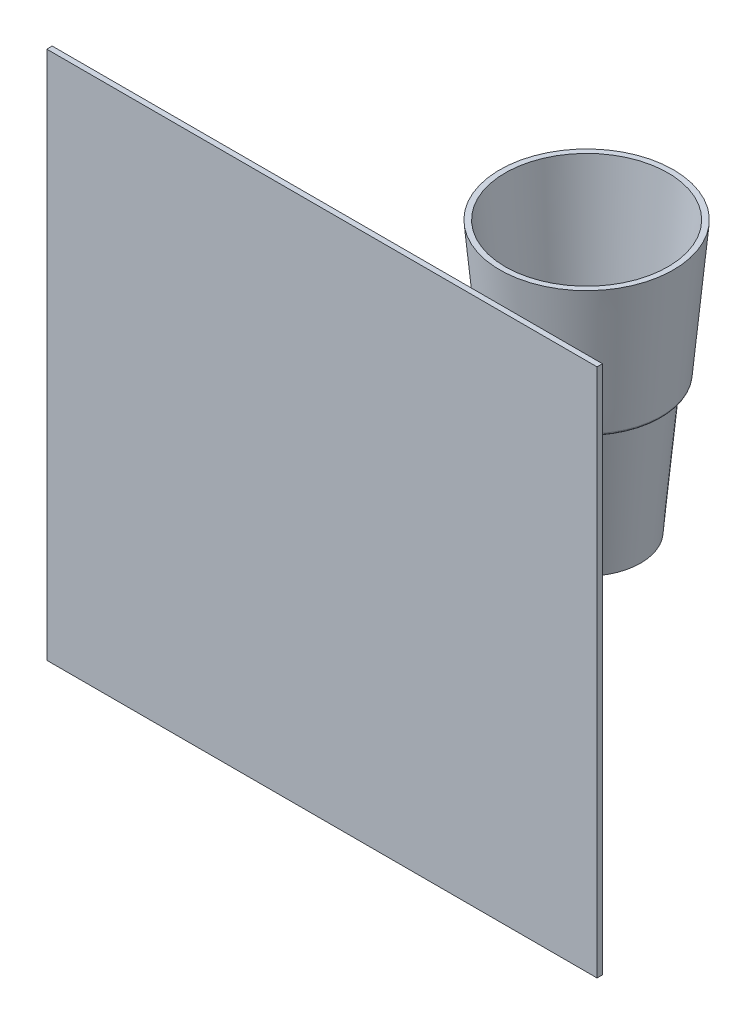
ISO-10303-21;
HEADER;
FILE_DESCRIPTION(('STEP AP214'),'2;1');
FILE_NAME('part.step','',(''),(''),'','','');
FILE_SCHEMA(('AUTOMOTIVE_DESIGN { 1 0 10303 214 1 1 1 1 }'));
ENDSEC;
DATA;
#1=APPLICATION_CONTEXT('core data for automotive mechanical design processes');
#2=APPLICATION_PROTOCOL_DEFINITION('international standard','automotive_design',2000,#1);
#3=PRODUCT_CONTEXT('',#1,'mechanical');
#4=PRODUCT('Part','Part','',(#3));
#5=PRODUCT_RELATED_PRODUCT_CATEGORY('part','',(#4));
#6=PRODUCT_DEFINITION_FORMATION('','',#4);
#7=PRODUCT_DEFINITION_CONTEXT('part definition',#1,'design');
#8=PRODUCT_DEFINITION('design','',#6,#7);
#9=PRODUCT_DEFINITION_SHAPE('','',#8);
#10=(LENGTH_UNIT() NAMED_UNIT(*) SI_UNIT(.MILLI.,.METRE.));
#11=(NAMED_UNIT(*) PLANE_ANGLE_UNIT() SI_UNIT($,.RADIAN.));
#12=(NAMED_UNIT(*) SI_UNIT($,.STERADIAN.) SOLID_ANGLE_UNIT());
#13=UNCERTAINTY_MEASURE_WITH_UNIT(LENGTH_MEASURE(1.E-05),#10,'distance_accuracy_value','');
#14=(GEOMETRIC_REPRESENTATION_CONTEXT(3) GLOBAL_UNCERTAINTY_ASSIGNED_CONTEXT((#13)) GLOBAL_UNIT_ASSIGNED_CONTEXT((#10,
#11,#12)) REPRESENTATION_CONTEXT('',''));
#15=CARTESIAN_POINT('',(0.,0.,0.));
#16=DIRECTION('',(0.,0.,1.));
#17=DIRECTION('',(1.,0.,0.));
#18=AXIS2_PLACEMENT_3D('',#15,#16,#17);
#19=CARTESIAN_POINT('',(-124.079395309859,199.173295070423,129.54));
#20=DIRECTION('',(1.,0.,0.));
#21=DIRECTION('',(0.,0.,-1.));
#22=AXIS2_PLACEMENT_3D('',#19,#20,#21);
#23=PLANE('',#22);
#24=DIRECTION('',(0.,-1.,0.));
#25=VECTOR('',#24,1.);
#26=CARTESIAN_POINT('',(-124.079395309859,199.173295070423,127.));
#27=LINE('',#26,#25);
#28=CARTESIAN_POINT('',(-124.079395309859,199.173295070423,127.));
#29=VERTEX_POINT('',#28);
#30=CARTESIAN_POINT('',(-124.079395309859,-49.4788529859149,127.));
#31=VERTEX_POINT('',#30);
#32=EDGE_CURVE('E119',#29,#31,#27,.T.);
#33=ORIENTED_EDGE('',*,*,#32,.T.);
#34=DIRECTION('',(0.,0.,-1.));
#35=VECTOR('',#34,1.);
#36=CARTESIAN_POINT('',(-124.079395309859,-49.4788529859149,129.54));
#37=LINE('',#36,#35);
#38=CARTESIAN_POINT('',(-124.079395309859,-49.4788529859149,129.54));
#39=VERTEX_POINT('',#38);
#40=EDGE_CURVE('E12',#39,#31,#37,.T.);
#41=ORIENTED_EDGE('',*,*,#40,.F.);
#42=DIRECTION('',(0.,-1.,0.));
#43=VECTOR('',#42,1.);
#44=CARTESIAN_POINT('',(-124.079395309859,199.173295070423,129.54));
#45=LINE('',#44,#43);
#46=CARTESIAN_POINT('',(-124.079395309859,199.173295070423,129.54));
#47=VERTEX_POINT('',#46);
#48=EDGE_CURVE('E103',#47,#39,#45,.T.);
#49=ORIENTED_EDGE('',*,*,#48,.F.);
#50=DIRECTION('',(0.,0.,-1.));
#51=VECTOR('',#50,1.);
#52=CARTESIAN_POINT('',(-124.079395309859,199.173295070423,129.54));
#53=LINE('',#52,#51);
#54=EDGE_CURVE('E115',#47,#29,#53,.T.);
#55=ORIENTED_EDGE('',*,*,#54,.T.);
#56=EDGE_LOOP('',(#33,#41,#49,#55));
#57=FACE_BOUND('',#56,.T.);
#58=ADVANCED_FACE('F51',(#57),#23,.F.);
#59=CARTESIAN_POINT('',(-124.079395309859,-49.4788529859149,129.54));
#60=DIRECTION('',(0.,1.,0.));
#61=DIRECTION('',(0.,0.,1.));
#62=AXIS2_PLACEMENT_3D('',#59,#60,#61);
#63=PLANE('',#62);
#64=DIRECTION('',(1.,0.,0.));
#65=VECTOR('',#64,1.);
#66=CARTESIAN_POINT('',(-124.079395309859,-49.4788529859149,127.));
#67=LINE('',#66,#65);
#68=CARTESIAN_POINT('',(134.439901478873,-49.4788529859149,127.));
#69=VERTEX_POINT('',#68);
#70=EDGE_CURVE('E108',#31,#69,#67,.T.);
#71=ORIENTED_EDGE('',*,*,#70,.T.);
#72=DIRECTION('',(0.,0.,-1.));
#73=VECTOR('',#72,1.);
#74=CARTESIAN_POINT('',(134.439901478873,-49.4788529859149,129.54));
#75=LINE('',#74,#73);
#76=CARTESIAN_POINT('',(134.439901478873,-49.4788529859149,129.54));
#77=VERTEX_POINT('',#76);
#78=EDGE_CURVE('E60',#77,#69,#75,.T.);
#79=ORIENTED_EDGE('',*,*,#78,.F.);
#80=DIRECTION('',(1.,0.,0.));
#81=VECTOR('',#80,1.);
#82=CARTESIAN_POINT('',(-124.079395309859,-49.4788529859149,129.54));
#83=LINE('',#82,#81);
#84=EDGE_CURVE('E98',#39,#77,#83,.T.);
#85=ORIENTED_EDGE('',*,*,#84,.F.);
#86=ORIENTED_EDGE('',*,*,#40,.T.);
#87=EDGE_LOOP('',(#71,#79,#85,#86));
#88=FACE_BOUND('',#87,.T.);
#89=ADVANCED_FACE('F107',(#88),#63,.F.);
#90=CARTESIAN_POINT('',(134.439901478873,199.173295070423,129.54));
#91=DIRECTION('',(-1.,0.,0.));
#92=DIRECTION('',(0.,0.,1.));
#93=AXIS2_PLACEMENT_3D('',#90,#91,#92);
#94=PLANE('',#93);
#95=DIRECTION('',(0.,1.,0.));
#96=VECTOR('',#95,1.);
#97=CARTESIAN_POINT('',(134.439901478873,199.173295070423,127.));
#98=LINE('',#97,#96);
#99=CARTESIAN_POINT('',(134.439901478873,199.173295070423,127.));
#100=VERTEX_POINT('',#99);
#101=EDGE_CURVE('E85',#69,#100,#98,.T.);
#102=ORIENTED_EDGE('',*,*,#101,.T.);
#103=DIRECTION('',(0.,0.,-1.));
#104=VECTOR('',#103,1.);
#105=CARTESIAN_POINT('',(134.439901478873,199.173295070423,129.54));
#106=LINE('',#105,#104);
#107=CARTESIAN_POINT('',(134.439901478873,199.173295070423,129.54));
#108=VERTEX_POINT('',#107);
#109=EDGE_CURVE('E110',#108,#100,#106,.T.);
#110=ORIENTED_EDGE('',*,*,#109,.F.);
#111=DIRECTION('',(0.,1.,0.));
#112=VECTOR('',#111,1.);
#113=CARTESIAN_POINT('',(134.439901478873,199.173295070423,129.54));
#114=LINE('',#113,#112);
#115=EDGE_CURVE('E101',#77,#108,#114,.T.);
#116=ORIENTED_EDGE('',*,*,#115,.F.);
#117=ORIENTED_EDGE('',*,*,#78,.T.);
#118=EDGE_LOOP('',(#102,#110,#116,#117));
#119=FACE_BOUND('',#118,.T.);
#120=ADVANCED_FACE('F111',(#119),#94,.F.);
#121=CARTESIAN_POINT('',(-124.079395309859,199.173295070423,129.54));
#122=DIRECTION('',(0.,-1.,0.));
#123=DIRECTION('',(0.,0.,-1.));
#124=AXIS2_PLACEMENT_3D('',#121,#122,#123);
#125=PLANE('',#124);
#126=DIRECTION('',(-1.,0.,0.));
#127=VECTOR('',#126,1.);
#128=CARTESIAN_POINT('',(-124.079395309859,199.173295070423,127.));
#129=LINE('',#128,#127);
#130=EDGE_CURVE('E91',#100,#29,#129,.T.);
#131=ORIENTED_EDGE('',*,*,#130,.T.);
#132=ORIENTED_EDGE('',*,*,#54,.F.);
#133=DIRECTION('',(-1.,0.,0.));
#134=VECTOR('',#133,1.);
#135=CARTESIAN_POINT('',(-124.079395309859,199.173295070423,129.54));
#136=LINE('',#135,#134);
#137=EDGE_CURVE('E68',#108,#47,#136,.T.);
#138=ORIENTED_EDGE('',*,*,#137,.F.);
#139=ORIENTED_EDGE('',*,*,#109,.T.);
#140=EDGE_LOOP('',(#131,#132,#138,#139));
#141=FACE_BOUND('',#140,.T.);
#142=ADVANCED_FACE('F132',(#141),#125,.F.);
#143=CARTESIAN_POINT('',(0.,0.,129.54));
#144=DIRECTION('',(0.,0.,1.));
#145=DIRECTION('',(1.,0.,0.));
#146=AXIS2_PLACEMENT_3D('',#143,#144,#145);
#147=PLANE('',#146);
#148=ORIENTED_EDGE('',*,*,#48,.T.);
#149=ORIENTED_EDGE('',*,*,#84,.T.);
#150=ORIENTED_EDGE('',*,*,#115,.T.);
#151=ORIENTED_EDGE('',*,*,#137,.T.);
#152=EDGE_LOOP('',(#148,#149,#150,#151));
#153=FACE_BOUND('',#152,.T.);
#154=ADVANCED_FACE('F99',(#153),#147,.T.);
#155=CARTESIAN_POINT('',(0.,0.,127.));
#156=DIRECTION('',(0.,0.,1.));
#157=DIRECTION('',(1.,0.,0.));
#158=AXIS2_PLACEMENT_3D('',#155,#156,#157);
#159=PLANE('',#158);
#160=ORIENTED_EDGE('',*,*,#32,.F.);
#161=ORIENTED_EDGE('',*,*,#130,.F.);
#162=ORIENTED_EDGE('',*,*,#101,.F.);
#163=ORIENTED_EDGE('',*,*,#70,.F.);
#164=EDGE_LOOP('',(#160,#161,#162,#163));
#165=FACE_BOUND('',#164,.T.);
#166=ADVANCED_FACE('F135',(#165),#159,.F.);
#167=CLOSED_SHELL('',(#58,#89,#120,#142,#154,#166));
#168=MANIFOLD_SOLID_BREP('B2',#167);
#169=CARTESIAN_POINT('',(0.,0.,0.));
#170=DIRECTION('',(0.,-1.,0.));
#171=DIRECTION('',(0.,0.,-1.));
#172=AXIS2_PLACEMENT_3D('',#169,#170,#171);
#173=PLANE('',#172);
#174=CARTESIAN_POINT('',(0.,0.,0.));
#175=DIRECTION('',(0.,-1.,0.));
#176=DIRECTION('',(0.,0.,-1.));
#177=AXIS2_PLACEMENT_3D('',#174,#175,#176);
#178=CIRCLE('',#177,25.4);
#179=CARTESIAN_POINT('',(0.,0.,-25.4));
#180=VERTEX_POINT('',#179);
#181=EDGE_CURVE('E223',#180,#180,#178,.T.);
#182=ORIENTED_EDGE('',*,*,#181,.T.);
#183=EDGE_LOOP('',(#182));
#184=FACE_BOUND('',#183,.T.);
#185=ADVANCED_FACE('F199',(#184),#173,.T.);
#186=CARTESIAN_POINT('',(0.,0.,0.));
#187=DIRECTION('',(0.,1.,0.));
#188=DIRECTION('',(0.,0.,1.));
#189=AXIS2_PLACEMENT_3D('',#186,#187,#188);
#190=CONICAL_SURFACE('',#189,25.4,0.090865272289573);
#191=CARTESIAN_POINT('',(0.,62.3452401628977,0.));
#192=DIRECTION('',(0.,1.,0.));
#193=DIRECTION('',(0.,0.,1.));
#194=AXIS2_PLACEMENT_3D('',#191,#192,#193);
#195=CIRCLE('',#194,31.0806599543019);
#196=CARTESIAN_POINT('',(0.,62.3452401628977,31.0806599543019));
#197=VERTEX_POINT('',#196);
#198=EDGE_CURVE('E50',#197,#197,#195,.F.);
#199=ORIENTED_EDGE('',*,*,#198,.T.);
#200=EDGE_LOOP('',(#199));
#201=FACE_BOUND('',#200,.T.);
#202=ORIENTED_EDGE('',*,*,#181,.F.);
#203=EDGE_LOOP('',(#202));
#204=FACE_BOUND('',#203,.T.);
#205=ADVANCED_FACE('F267',(#201,#204),#190,.T.);
#206=CARTESIAN_POINT('',(31.1858772563177,63.5,0.));
#207=DIRECTION('',(0.,-1.,0.));
#208=DIRECTION('',(0.,0.,-1.));
#209=AXIS2_PLACEMENT_3D('',#206,#207,#208);
#210=PLANE('',#209);
#211=CARTESIAN_POINT('',(0.,63.5,0.));
#212=DIRECTION('',(0.,-1.,0.));
#213=DIRECTION('',(0.,0.,-1.));
#214=AXIS2_PLACEMENT_3D('',#211,#212,#213);
#215=CIRCLE('',#214,33.8363338280546);
#216=CARTESIAN_POINT('',(0.,63.5,-33.8363338280546));
#217=VERTEX_POINT('',#216);
#218=EDGE_CURVE('E212',#217,#217,#215,.T.);
#219=ORIENTED_EDGE('',*,*,#218,.T.);
#220=EDGE_LOOP('',(#219));
#221=FACE_BOUND('',#220,.T.);
#222=CARTESIAN_POINT('',(0.,63.5,0.));
#223=DIRECTION('',(0.,-1.,0.));
#224=DIRECTION('',(0.,0.,-1.));
#225=AXIS2_PLACEMENT_3D('',#222,#223,#224);
#226=CIRCLE('',#225,32.3454206845807);
#227=CARTESIAN_POINT('',(0.,63.5,-32.3454206845807));
#228=VERTEX_POINT('',#227);
#229=EDGE_CURVE('E217',#228,#228,#226,.F.);
#230=ORIENTED_EDGE('',*,*,#229,.T.);
#231=EDGE_LOOP('',(#230));
#232=FACE_BOUND('',#231,.T.);
#233=ADVANCED_FACE('F273',(#221,#232),#210,.T.);
#234=CARTESIAN_POINT('',(0.,63.5,0.));
#235=DIRECTION('',(0.,1.,0.));
#236=DIRECTION('',(0.,0.,1.));
#237=AXIS2_PLACEMENT_3D('',#234,#235,#236);
#238=CONICAL_SURFACE('',#237,34.9958772563177,0.0908652722895731);
#239=CARTESIAN_POINT('',(0.,64.6547598371023,0.));
#240=DIRECTION('',(0.,-1.,0.));
#241=DIRECTION('',(0.,0.,-1.));
#242=AXIS2_PLACEMENT_3D('',#239,#240,#241);
#243=CIRCLE('',#242,35.1010945583334);
#244=CARTESIAN_POINT('',(0.,64.6547598371023,-35.1010945583334));
#245=VERTEX_POINT('',#244);
#246=EDGE_CURVE('E207',#245,#245,#243,.F.);
#247=ORIENTED_EDGE('',*,*,#246,.T.);
#248=EDGE_LOOP('',(#247));
#249=FACE_BOUND('',#248,.T.);
#250=CARTESIAN_POINT('',(0.,127.,0.));
#251=DIRECTION('',(0.,-1.,0.));
#252=DIRECTION('',(0.,0.,-1.));
#253=AXIS2_PLACEMENT_3D('',#250,#251,#252);
#254=CIRCLE('',#253,40.7817545126354);
#255=CARTESIAN_POINT('',(0.,127.,-40.7817545126354));
#256=VERTEX_POINT('',#255);
#257=EDGE_CURVE('E227',#256,#256,#254,.T.);
#258=ORIENTED_EDGE('',*,*,#257,.T.);
#259=EDGE_LOOP('',(#258));
#260=FACE_BOUND('',#259,.T.);
#261=ADVANCED_FACE('F282',(#249,#260),#238,.T.);
#262=CARTESIAN_POINT('',(40.7817545126354,127.,0.));
#263=DIRECTION('',(0.,1.,0.));
#264=DIRECTION('',(0.,0.,1.));
#265=AXIS2_PLACEMENT_3D('',#262,#263,#264);
#266=PLANE('',#265);
#267=CARTESIAN_POINT('',(0.,127.,0.));
#268=DIRECTION('',(0.,1.,0.));
#269=DIRECTION('',(0.,0.,1.));
#270=AXIS2_PLACEMENT_3D('',#267,#268,#269);
#271=CIRCLE('',#270,38.2312325658566);
#272=CARTESIAN_POINT('',(0.,127.,38.2312325658566));
#273=VERTEX_POINT('',#272);
#274=EDGE_CURVE('E232',#273,#273,#271,.F.);
#275=ORIENTED_EDGE('',*,*,#274,.T.);
#276=EDGE_LOOP('',(#275));
#277=FACE_BOUND('',#276,.T.);
#278=ORIENTED_EDGE('',*,*,#257,.F.);
#279=EDGE_LOOP('',(#278));
#280=FACE_BOUND('',#279,.T.);
#281=ADVANCED_FACE('F277',(#277,#280),#266,.T.);
#282=CARTESIAN_POINT('',(0.,64.77,0.));
#283=DIRECTION('',(0.,-1.,0.));
#284=DIRECTION('',(0.,0.,-1.));
#285=AXIS2_PLACEMENT_3D('',#282,#283,#284);
#286=TOROIDAL_SURFACE('',#285,33.8363338280546,1.27);
#287=ORIENTED_EDGE('',*,*,#246,.F.);
#288=EDGE_LOOP('',(#287));
#289=FACE_BOUND('',#288,.T.);
#290=ORIENTED_EDGE('',*,*,#218,.F.);
#291=EDGE_LOOP('',(#290));
#292=FACE_BOUND('',#291,.T.);
#293=ADVANCED_FACE('F264',(#289,#292),#286,.T.);
#294=CARTESIAN_POINT('',(0.,62.23,0.));
#295=DIRECTION('',(0.,-1.,0.));
#296=DIRECTION('',(0.,0.,-1.));
#297=AXIS2_PLACEMENT_3D('',#294,#295,#296);
#298=TOROIDAL_SURFACE('',#297,32.3454206845807,1.27);
#299=ORIENTED_EDGE('',*,*,#229,.F.);
#300=EDGE_LOOP('',(#299));
#301=FACE_BOUND('',#300,.T.);
#302=ORIENTED_EDGE('',*,*,#198,.F.);
#303=EDGE_LOOP('',(#302));
#304=FACE_BOUND('',#303,.T.);
#305=ADVANCED_FACE('F201',(#301,#304),#298,.F.);
#306=CARTESIAN_POINT('',(0.,2.54,0.));
#307=DIRECTION('',(0.,-1.,0.));
#308=DIRECTION('',(0.,0.,-1.));
#309=AXIS2_PLACEMENT_3D('',#306,#307,#308);
#310=PLANE('',#309);
#311=CARTESIAN_POINT('',(0.,2.54,0.));
#312=DIRECTION('',(0.,-1.,0.));
#313=DIRECTION('',(0.,0.,-1.));
#314=AXIS2_PLACEMENT_3D('',#311,#312,#313);
#315=CIRCLE('',#314,23.0809131434739);
#316=CARTESIAN_POINT('',(0.,2.54,-23.0809131434739));
#317=VERTEX_POINT('',#316);
#318=EDGE_CURVE('E236',#317,#317,#315,.T.);
#319=ORIENTED_EDGE('',*,*,#318,.F.);
#320=EDGE_LOOP('',(#319));
#321=FACE_BOUND('',#320,.T.);
#322=ADVANCED_FACE('F254',(#321),#310,.F.);
#323=CARTESIAN_POINT('',(0.,0.230480325795393,0.));
#324=DIRECTION('',(0.,1.,0.));
#325=DIRECTION('',(0.,0.,1.));
#326=AXIS2_PLACEMENT_3D('',#323,#324,#325);
#327=CONICAL_SURFACE('',#326,22.8704785394424,0.090865272289573);
#328=CARTESIAN_POINT('',(0.,62.5757204886931,0.));
#329=DIRECTION('',(0.,1.,0.));
#330=DIRECTION('',(0.,0.,1.));
#331=AXIS2_PLACEMENT_3D('',#328,#329,#330);
#332=CIRCLE('',#331,28.5511384937444);
#333=CARTESIAN_POINT('',(0.,62.5757204886931,28.5511384937444));
#334=VERTEX_POINT('',#333);
#335=EDGE_CURVE('E231',#334,#334,#332,.F.);
#336=ORIENTED_EDGE('',*,*,#335,.F.);
#337=EDGE_LOOP('',(#336));
#338=FACE_BOUND('',#337,.T.);
#339=ORIENTED_EDGE('',*,*,#318,.T.);
#340=EDGE_LOOP('',(#339));
#341=FACE_BOUND('',#340,.T.);
#342=ADVANCED_FACE('F252',(#338,#341),#327,.F.);
#343=CARTESIAN_POINT('',(31.1858772563177,66.04,0.));
#344=DIRECTION('',(0.,-1.,0.));
#345=DIRECTION('',(0.,0.,-1.));
#346=AXIS2_PLACEMENT_3D('',#343,#344,#345);
#347=PLANE('',#346);
#348=CARTESIAN_POINT('',(0.,66.04,0.));
#349=DIRECTION('',(0.,-1.,0.));
#350=DIRECTION('',(0.,0.,-1.));
#351=AXIS2_PLACEMENT_3D('',#348,#349,#350);
#352=CIRCLE('',#351,32.6767903997916);
#353=CARTESIAN_POINT('',(0.,66.04,-32.6767903997916));
#354=VERTEX_POINT('',#353);
#355=EDGE_CURVE('E237',#354,#354,#352,.T.);
#356=ORIENTED_EDGE('',*,*,#355,.F.);
#357=EDGE_LOOP('',(#356));
#358=FACE_BOUND('',#357,.T.);
#359=CARTESIAN_POINT('',(0.,66.04,0.));
#360=DIRECTION('',(0.,-1.,0.));
#361=DIRECTION('',(0.,0.,-1.));
#362=AXIS2_PLACEMENT_3D('',#359,#360,#361);
#363=CIRCLE('',#362,32.3454206845807);
#364=CARTESIAN_POINT('',(0.,66.04,-32.3454206845807));
#365=VERTEX_POINT('',#364);
#366=EDGE_CURVE('E241',#365,#365,#363,.F.);
#367=ORIENTED_EDGE('',*,*,#366,.F.);
#368=EDGE_LOOP('',(#367));
#369=FACE_BOUND('',#368,.T.);
#370=ADVANCED_FACE('F261',(#358,#369),#347,.F.);
#371=CARTESIAN_POINT('',(0.,63.7304803257954,0.));
#372=DIRECTION('',(0.,1.,0.));
#373=DIRECTION('',(0.,0.,1.));
#374=AXIS2_PLACEMENT_3D('',#371,#372,#373);
#375=CONICAL_SURFACE('',#374,32.4663557957601,0.0908652722895731);
#376=ORIENTED_EDGE('',*,*,#355,.T.);
#377=EDGE_LOOP('',(#376));
#378=FACE_BOUND('',#377,.T.);
#379=ORIENTED_EDGE('',*,*,#274,.F.);
#380=EDGE_LOOP('',(#379));
#381=FACE_BOUND('',#380,.T.);
#382=ADVANCED_FACE('F300',(#378,#381),#375,.F.);
#383=CARTESIAN_POINT('',(0.,62.23,0.));
#384=DIRECTION('',(0.,-1.,0.));
#385=DIRECTION('',(0.,0.,-1.));
#386=AXIS2_PLACEMENT_3D('',#383,#384,#385);
#387=TOROIDAL_SURFACE('',#386,32.3454206845807,3.81);
#388=ORIENTED_EDGE('',*,*,#366,.T.);
#389=EDGE_LOOP('',(#388));
#390=FACE_BOUND('',#389,.T.);
#391=ORIENTED_EDGE('',*,*,#335,.T.);
#392=EDGE_LOOP('',(#391));
#393=FACE_BOUND('',#392,.T.);
#394=ADVANCED_FACE('F297',(#390,#393),#387,.T.);
#395=CLOSED_SHELL('',(#185,#205,#233,#261,#281,#293,#305,#322,#342,#370,#382,#394));
#396=MANIFOLD_SOLID_BREP('B6',#395);
#397=ADVANCED_BREP_SHAPE_REPRESENTATION('',(#18,#168,#396),#14);
#398=SHAPE_DEFINITION_REPRESENTATION(#9,#397);
ENDSEC;
END-ISO-10303-21;
